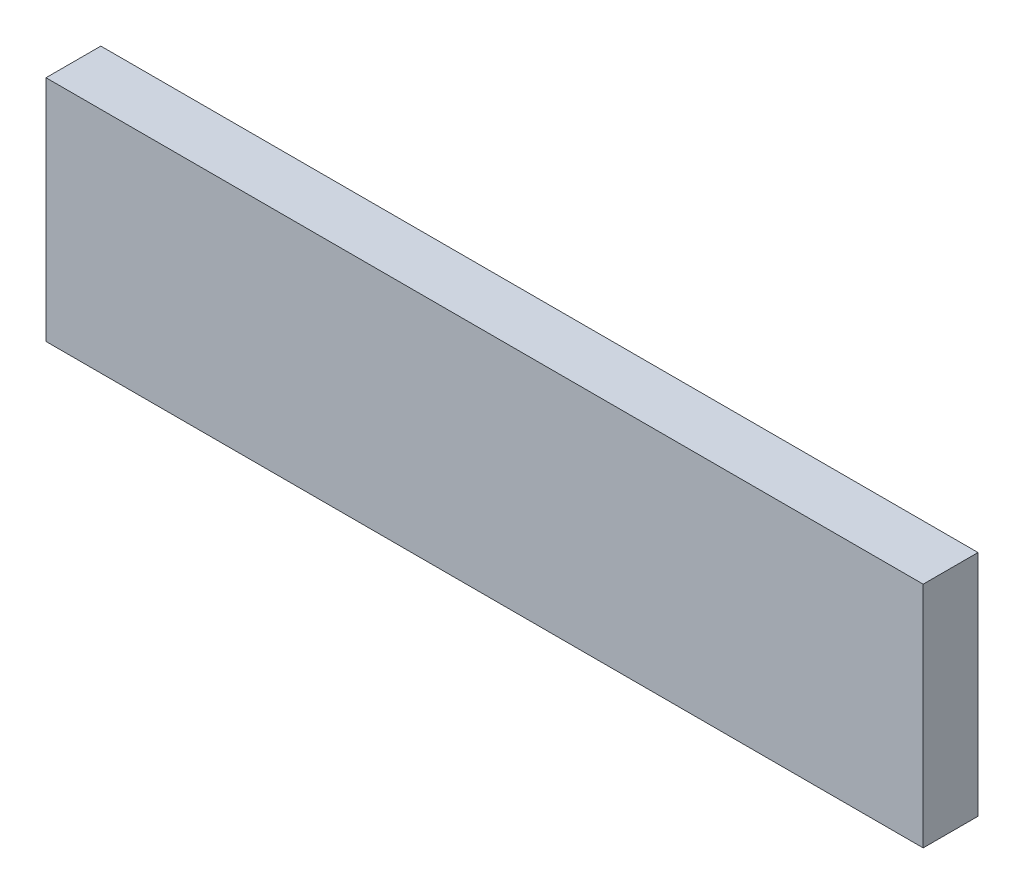
ISO-10303-21;
HEADER;
FILE_DESCRIPTION(('STEP AP214'),'2;1');
FILE_NAME('part.step','',(''),(''),'','','');
FILE_SCHEMA(('AUTOMOTIVE_DESIGN { 1 0 10303 214 1 1 1 1 }'));
ENDSEC;
DATA;
#1=APPLICATION_CONTEXT('core data for automotive mechanical design processes');
#2=APPLICATION_PROTOCOL_DEFINITION('international standard','automotive_design',2000,#1);
#3=PRODUCT_CONTEXT('',#1,'mechanical');
#4=PRODUCT('Part','Part','',(#3));
#5=PRODUCT_RELATED_PRODUCT_CATEGORY('part','',(#4));
#6=PRODUCT_DEFINITION_FORMATION('','',#4);
#7=PRODUCT_DEFINITION_CONTEXT('part definition',#1,'design');
#8=PRODUCT_DEFINITION('design','',#6,#7);
#9=PRODUCT_DEFINITION_SHAPE('','',#8);
#10=(LENGTH_UNIT() NAMED_UNIT(*) SI_UNIT(.MILLI.,.METRE.));
#11=(NAMED_UNIT(*) PLANE_ANGLE_UNIT() SI_UNIT($,.RADIAN.));
#12=(NAMED_UNIT(*) SI_UNIT($,.STERADIAN.) SOLID_ANGLE_UNIT());
#13=UNCERTAINTY_MEASURE_WITH_UNIT(LENGTH_MEASURE(1.E-05),#10,'distance_accuracy_value','');
#14=(GEOMETRIC_REPRESENTATION_CONTEXT(3) GLOBAL_UNCERTAINTY_ASSIGNED_CONTEXT((#13)) GLOBAL_UNIT_ASSIGNED_CONTEXT((#10,
#11,#12)) REPRESENTATION_CONTEXT('',''));
#15=CARTESIAN_POINT('',(0.,0.,0.));
#16=DIRECTION('',(0.,0.,1.));
#17=DIRECTION('',(1.,0.,0.));
#18=AXIS2_PLACEMENT_3D('',#15,#16,#17);
#19=CARTESIAN_POINT('',(96.,25.,6.));
#20=DIRECTION('',(-1.,0.,0.));
#21=DIRECTION('',(0.,-1.,0.));
#22=AXIS2_PLACEMENT_3D('',#19,#20,#21);
#23=PLANE('',#22);
#24=DIRECTION('',(0.,1.,0.));
#25=VECTOR('',#24,1.);
#26=CARTESIAN_POINT('',(96.,25.,-6.));
#27=LINE('',#26,#25);
#28=CARTESIAN_POINT('',(96.,-25.,-6.));
#29=VERTEX_POINT('',#28);
#30=CARTESIAN_POINT('',(96.,25.,-6.));
#31=VERTEX_POINT('',#30);
#32=EDGE_CURVE('E101',#29,#31,#27,.T.);
#33=ORIENTED_EDGE('',*,*,#32,.T.);
#34=DIRECTION('',(0.,0.,-1.));
#35=VECTOR('',#34,1.);
#36=CARTESIAN_POINT('',(96.,25.,6.));
#37=LINE('',#36,#35);
#38=CARTESIAN_POINT('',(96.,25.,6.));
#39=VERTEX_POINT('',#38);
#40=EDGE_CURVE('E11',#39,#31,#37,.T.);
#41=ORIENTED_EDGE('',*,*,#40,.F.);
#42=DIRECTION('',(0.,1.,0.));
#43=VECTOR('',#42,1.);
#44=CARTESIAN_POINT('',(96.,25.,6.));
#45=LINE('',#44,#43);
#46=CARTESIAN_POINT('',(96.,-25.,6.));
#47=VERTEX_POINT('',#46);
#48=EDGE_CURVE('E88',#47,#39,#45,.T.);
#49=ORIENTED_EDGE('',*,*,#48,.F.);
#50=DIRECTION('',(0.,0.,-1.));
#51=VECTOR('',#50,1.);
#52=CARTESIAN_POINT('',(96.,-25.,6.));
#53=LINE('',#52,#51);
#54=EDGE_CURVE('E97',#47,#29,#53,.T.);
#55=ORIENTED_EDGE('',*,*,#54,.T.);
#56=EDGE_LOOP('',(#33,#41,#49,#55));
#57=FACE_BOUND('',#56,.T.);
#58=ADVANCED_FACE('F35',(#57),#23,.F.);
#59=CARTESIAN_POINT('',(-96.,25.,6.));
#60=DIRECTION('',(0.,-1.,0.));
#61=DIRECTION('',(1.,0.,0.));
#62=AXIS2_PLACEMENT_3D('',#59,#60,#61);
#63=PLANE('',#62);
#64=DIRECTION('',(-1.,0.,0.));
#65=VECTOR('',#64,1.);
#66=CARTESIAN_POINT('',(-96.,25.,-6.));
#67=LINE('',#66,#65);
#68=CARTESIAN_POINT('',(-96.,25.,-6.));
#69=VERTEX_POINT('',#68);
#70=EDGE_CURVE('E92',#31,#69,#67,.T.);
#71=ORIENTED_EDGE('',*,*,#70,.T.);
#72=DIRECTION('',(0.,0.,-1.));
#73=VECTOR('',#72,1.);
#74=CARTESIAN_POINT('',(-96.,25.,6.));
#75=LINE('',#74,#73);
#76=CARTESIAN_POINT('',(-96.,25.,6.));
#77=VERTEX_POINT('',#76);
#78=EDGE_CURVE('E44',#77,#69,#75,.T.);
#79=ORIENTED_EDGE('',*,*,#78,.F.);
#80=DIRECTION('',(-1.,0.,0.));
#81=VECTOR('',#80,1.);
#82=CARTESIAN_POINT('',(-96.,25.,6.));
#83=LINE('',#82,#81);
#84=EDGE_CURVE('E83',#39,#77,#83,.T.);
#85=ORIENTED_EDGE('',*,*,#84,.F.);
#86=ORIENTED_EDGE('',*,*,#40,.T.);
#87=EDGE_LOOP('',(#71,#79,#85,#86));
#88=FACE_BOUND('',#87,.T.);
#89=ADVANCED_FACE('F91',(#88),#63,.F.);
#90=CARTESIAN_POINT('',(-96.,25.,6.));
#91=DIRECTION('',(1.,0.,0.));
#92=DIRECTION('',(0.,1.,0.));
#93=AXIS2_PLACEMENT_3D('',#90,#91,#92);
#94=PLANE('',#93);
#95=DIRECTION('',(0.,-1.,0.));
#96=VECTOR('',#95,1.);
#97=CARTESIAN_POINT('',(-96.,25.,-6.));
#98=LINE('',#97,#96);
#99=CARTESIAN_POINT('',(-96.,-25.,-6.));
#100=VERTEX_POINT('',#99);
#101=EDGE_CURVE('E70',#69,#100,#98,.T.);
#102=ORIENTED_EDGE('',*,*,#101,.T.);
#103=DIRECTION('',(0.,0.,-1.));
#104=VECTOR('',#103,1.);
#105=CARTESIAN_POINT('',(-96.,-25.,6.));
#106=LINE('',#105,#104);
#107=CARTESIAN_POINT('',(-96.,-25.,6.));
#108=VERTEX_POINT('',#107);
#109=EDGE_CURVE('E93',#108,#100,#106,.T.);
#110=ORIENTED_EDGE('',*,*,#109,.F.);
#111=DIRECTION('',(0.,-1.,0.));
#112=VECTOR('',#111,1.);
#113=CARTESIAN_POINT('',(-96.,25.,6.));
#114=LINE('',#113,#112);
#115=EDGE_CURVE('E86',#77,#108,#114,.T.);
#116=ORIENTED_EDGE('',*,*,#115,.F.);
#117=ORIENTED_EDGE('',*,*,#78,.T.);
#118=EDGE_LOOP('',(#102,#110,#116,#117));
#119=FACE_BOUND('',#118,.T.);
#120=ADVANCED_FACE('F95',(#119),#94,.F.);
#121=CARTESIAN_POINT('',(-96.,-25.,6.));
#122=DIRECTION('',(0.,1.,0.));
#123=DIRECTION('',(0.,0.,1.));
#124=AXIS2_PLACEMENT_3D('',#121,#122,#123);
#125=PLANE('',#124);
#126=CARTESIAN_POINT('',(77.5,-25.,0.));
#127=DIRECTION('',(0.,1.,0.));
#128=DIRECTION('',(0.,0.,1.));
#129=AXIS2_PLACEMENT_3D('',#126,#127,#128);
#130=CIRCLE('',#129,1.5);
#131=CARTESIAN_POINT('',(77.5,-25.,1.5));
#132=VERTEX_POINT('',#131);
#133=EDGE_CURVE('E38',#132,#132,#130,.T.);
#134=ORIENTED_EDGE('',*,*,#133,.T.);
#135=EDGE_LOOP('',(#134));
#136=FACE_BOUND('',#135,.T.);
#137=CARTESIAN_POINT('',(-77.5,-25.,0.));
#138=DIRECTION('',(0.,1.,0.));
#139=DIRECTION('',(0.,0.,1.));
#140=AXIS2_PLACEMENT_3D('',#137,#138,#139);
#141=CIRCLE('',#140,1.5);
#142=CARTESIAN_POINT('',(-77.5,-25.,1.5));
#143=VERTEX_POINT('',#142);
#144=EDGE_CURVE('E104',#143,#143,#141,.T.);
#145=ORIENTED_EDGE('',*,*,#144,.T.);
#146=EDGE_LOOP('',(#145));
#147=FACE_BOUND('',#146,.T.);
#148=DIRECTION('',(1.,0.,0.));
#149=VECTOR('',#148,1.);
#150=CARTESIAN_POINT('',(-96.,-25.,-6.));
#151=LINE('',#150,#149);
#152=EDGE_CURVE('E76',#100,#29,#151,.T.);
#153=ORIENTED_EDGE('',*,*,#152,.T.);
#154=ORIENTED_EDGE('',*,*,#54,.F.);
#155=DIRECTION('',(1.,0.,0.));
#156=VECTOR('',#155,1.);
#157=CARTESIAN_POINT('',(-96.,-25.,6.));
#158=LINE('',#157,#156);
#159=EDGE_CURVE('E53',#108,#47,#158,.T.);
#160=ORIENTED_EDGE('',*,*,#159,.F.);
#161=ORIENTED_EDGE('',*,*,#109,.T.);
#162=EDGE_LOOP('',(#153,#154,#160,#161));
#163=FACE_BOUND('',#162,.T.);
#164=ADVANCED_FACE('F132',(#136,#147,#163),#125,.F.);
#165=CARTESIAN_POINT('',(0.,0.,6.));
#166=DIRECTION('',(0.,0.,1.));
#167=DIRECTION('',(1.,0.,0.));
#168=AXIS2_PLACEMENT_3D('',#165,#166,#167);
#169=PLANE('',#168);
#170=ORIENTED_EDGE('',*,*,#48,.T.);
#171=ORIENTED_EDGE('',*,*,#84,.T.);
#172=ORIENTED_EDGE('',*,*,#115,.T.);
#173=ORIENTED_EDGE('',*,*,#159,.T.);
#174=EDGE_LOOP('',(#170,#171,#172,#173));
#175=FACE_BOUND('',#174,.T.);
#176=ADVANCED_FACE('F84',(#175),#169,.T.);
#177=CARTESIAN_POINT('',(0.,0.,-6.));
#178=DIRECTION('',(0.,0.,1.));
#179=DIRECTION('',(1.,0.,0.));
#180=AXIS2_PLACEMENT_3D('',#177,#178,#179);
#181=PLANE('',#180);
#182=ORIENTED_EDGE('',*,*,#32,.F.);
#183=ORIENTED_EDGE('',*,*,#152,.F.);
#184=ORIENTED_EDGE('',*,*,#101,.F.);
#185=ORIENTED_EDGE('',*,*,#70,.F.);
#186=EDGE_LOOP('',(#182,#183,#184,#185));
#187=FACE_BOUND('',#186,.T.);
#188=ADVANCED_FACE('F139',(#187),#181,.F.);
#189=CARTESIAN_POINT('',(-77.5,-10.,0.));
#190=DIRECTION('',(0.,-1.,0.));
#191=DIRECTION('',(0.,0.,-1.));
#192=AXIS2_PLACEMENT_3D('',#189,#190,#191);
#193=CYLINDRICAL_SURFACE('',#192,1.5);
#194=CARTESIAN_POINT('',(-77.5,-10.,0.));
#195=DIRECTION('',(0.,-1.,0.));
#196=DIRECTION('',(0.,0.,-1.));
#197=AXIS2_PLACEMENT_3D('',#194,#195,#196);
#198=CIRCLE('',#197,1.5);
#199=CARTESIAN_POINT('',(-77.5,-10.,-1.5));
#200=VERTEX_POINT('',#199);
#201=EDGE_CURVE('E110',#200,#200,#198,.T.);
#202=ORIENTED_EDGE('',*,*,#201,.F.);
#203=EDGE_LOOP('',(#202));
#204=FACE_BOUND('',#203,.T.);
#205=ORIENTED_EDGE('',*,*,#144,.F.);
#206=EDGE_LOOP('',(#205));
#207=FACE_BOUND('',#206,.T.);
#208=ADVANCED_FACE('F151',(#204,#207),#193,.F.);
#209=CARTESIAN_POINT('',(-77.5,-10.,0.));
#210=DIRECTION('',(0.,-1.,0.));
#211=DIRECTION('',(0.,0.,-1.));
#212=AXIS2_PLACEMENT_3D('',#209,#210,#211);
#213=PLANE('',#212);
#214=ORIENTED_EDGE('',*,*,#201,.T.);
#215=EDGE_LOOP('',(#214));
#216=FACE_BOUND('',#215,.T.);
#217=ADVANCED_FACE('F128',(#216),#213,.T.);
#218=CARTESIAN_POINT('',(77.5,-10.,0.));
#219=DIRECTION('',(0.,-1.,0.));
#220=DIRECTION('',(0.,0.,-1.));
#221=AXIS2_PLACEMENT_3D('',#218,#219,#220);
#222=CYLINDRICAL_SURFACE('',#221,1.5);
#223=CARTESIAN_POINT('',(77.5,-10.,0.));
#224=DIRECTION('',(0.,-1.,0.));
#225=DIRECTION('',(0.,0.,-1.));
#226=AXIS2_PLACEMENT_3D('',#223,#224,#225);
#227=CIRCLE('',#226,1.5);
#228=CARTESIAN_POINT('',(77.5,-10.,-1.5));
#229=VERTEX_POINT('',#228);
#230=EDGE_CURVE('E118',#229,#229,#227,.T.);
#231=ORIENTED_EDGE('',*,*,#230,.F.);
#232=EDGE_LOOP('',(#231));
#233=FACE_BOUND('',#232,.T.);
#234=ORIENTED_EDGE('',*,*,#133,.F.);
#235=EDGE_LOOP('',(#234));
#236=FACE_BOUND('',#235,.T.);
#237=ADVANCED_FACE('F125',(#233,#236),#222,.F.);
#238=CARTESIAN_POINT('',(77.5,-10.,0.));
#239=DIRECTION('',(0.,-1.,0.));
#240=DIRECTION('',(0.,0.,-1.));
#241=AXIS2_PLACEMENT_3D('',#238,#239,#240);
#242=PLANE('',#241);
#243=ORIENTED_EDGE('',*,*,#230,.T.);
#244=EDGE_LOOP('',(#243));
#245=FACE_BOUND('',#244,.T.);
#246=ADVANCED_FACE('F123',(#245),#242,.T.);
#247=CLOSED_SHELL('',(#58,#89,#120,#164,#176,#188,#208,#217,#237,#246));
#248=MANIFOLD_SOLID_BREP('B2',#247);
#249=ADVANCED_BREP_SHAPE_REPRESENTATION('',(#18,#248),#14);
#250=SHAPE_DEFINITION_REPRESENTATION(#9,#249);
ENDSEC;
END-ISO-10303-21;
